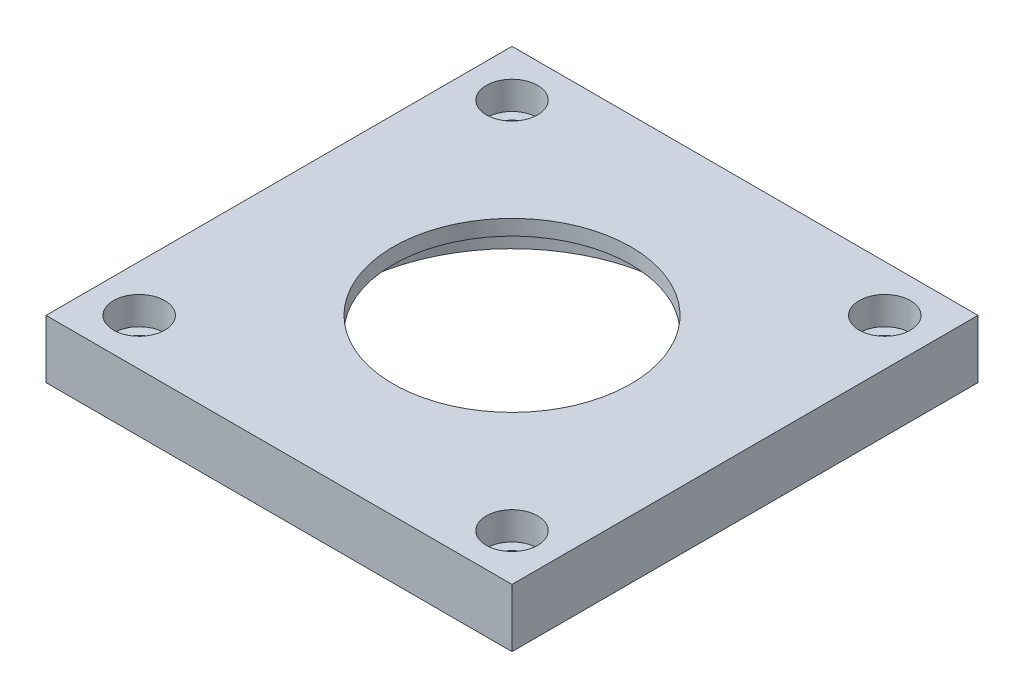
ISO-10303-21;
HEADER;
FILE_DESCRIPTION(('STEP AP214'),'2;1');
FILE_NAME('part.step','',(''),(''),'','','');
FILE_SCHEMA(('AUTOMOTIVE_DESIGN { 1 0 10303 214 1 1 1 1 }'));
ENDSEC;
DATA;
#1=APPLICATION_CONTEXT('core data for automotive mechanical design processes');
#2=APPLICATION_PROTOCOL_DEFINITION('international standard','automotive_design',2000,#1);
#3=PRODUCT_CONTEXT('',#1,'mechanical');
#4=PRODUCT('Part','Part','',(#3));
#5=PRODUCT_RELATED_PRODUCT_CATEGORY('part','',(#4));
#6=PRODUCT_DEFINITION_FORMATION('','',#4);
#7=PRODUCT_DEFINITION_CONTEXT('part definition',#1,'design');
#8=PRODUCT_DEFINITION('design','',#6,#7);
#9=PRODUCT_DEFINITION_SHAPE('','',#8);
#10=(LENGTH_UNIT() NAMED_UNIT(*) SI_UNIT(.MILLI.,.METRE.));
#11=(NAMED_UNIT(*) PLANE_ANGLE_UNIT() SI_UNIT($,.RADIAN.));
#12=(NAMED_UNIT(*) SI_UNIT($,.STERADIAN.) SOLID_ANGLE_UNIT());
#13=UNCERTAINTY_MEASURE_WITH_UNIT(LENGTH_MEASURE(1.E-05),#10,'distance_accuracy_value','');
#14=(GEOMETRIC_REPRESENTATION_CONTEXT(3) GLOBAL_UNCERTAINTY_ASSIGNED_CONTEXT((#13)) GLOBAL_UNIT_ASSIGNED_CONTEXT((#10,
#11,#12)) REPRESENTATION_CONTEXT('',''));
#15=CARTESIAN_POINT('',(0.,0.,0.));
#16=DIRECTION('',(0.,0.,1.));
#17=DIRECTION('',(1.,0.,0.));
#18=AXIS2_PLACEMENT_3D('',#15,#16,#17);
#19=CARTESIAN_POINT('',(-40.,12.5,40.));
#20=DIRECTION('',(0.,-1.,0.));
#21=DIRECTION('',(0.,0.,-1.));
#22=AXIS2_PLACEMENT_3D('',#19,#20,#21);
#23=CYLINDRICAL_SURFACE('',#22,3.25);
#24=CARTESIAN_POINT('',(-40.,0.,40.));
#25=DIRECTION('',(0.,-1.,0.));
#26=DIRECTION('',(0.,0.,-1.));
#27=AXIS2_PLACEMENT_3D('',#24,#25,#26);
#28=CIRCLE('',#27,3.25);
#29=CARTESIAN_POINT('',(-40.,0.,36.75));
#30=VERTEX_POINT('',#29);
#31=EDGE_CURVE('E164',#30,#30,#28,.T.);
#32=ORIENTED_EDGE('',*,*,#31,.T.);
#33=EDGE_LOOP('',(#32));
#34=FACE_BOUND('',#33,.T.);
#35=CARTESIAN_POINT('',(-40.,6.5,40.));
#36=DIRECTION('',(0.,1.,0.));
#37=DIRECTION('',(0.,0.,1.));
#38=AXIS2_PLACEMENT_3D('',#35,#36,#37);
#39=CIRCLE('',#38,3.25);
#40=CARTESIAN_POINT('',(-40.,6.5,43.25));
#41=VERTEX_POINT('',#40);
#42=EDGE_CURVE('E47',#41,#41,#39,.F.);
#43=ORIENTED_EDGE('',*,*,#42,.F.);
#44=EDGE_LOOP('',(#43));
#45=FACE_BOUND('',#44,.T.);
#46=ADVANCED_FACE('F43',(#34,#45),#23,.F.);
#47=CARTESIAN_POINT('',(39.9999999999996,12.5,40.0000000000004));
#48=DIRECTION('',(0.,-1.,0.));
#49=DIRECTION('',(0.,0.,-1.));
#50=AXIS2_PLACEMENT_3D('',#47,#48,#49);
#51=CYLINDRICAL_SURFACE('',#50,3.25);
#52=CARTESIAN_POINT('',(39.9999999999996,0.,40.0000000000004));
#53=DIRECTION('',(0.,-1.,0.));
#54=DIRECTION('',(-1.,0.,0.));
#55=AXIS2_PLACEMENT_3D('',#52,#53,#54);
#56=CIRCLE('',#55,3.25);
#57=CARTESIAN_POINT('',(36.7499999999996,0.,40.0000000000004));
#58=VERTEX_POINT('',#57);
#59=EDGE_CURVE('E134',#58,#58,#56,.T.);
#60=ORIENTED_EDGE('',*,*,#59,.T.);
#61=EDGE_LOOP('',(#60));
#62=FACE_BOUND('',#61,.T.);
#63=CARTESIAN_POINT('',(39.9999999999996,6.5,40.0000000000004));
#64=DIRECTION('',(0.,1.,0.));
#65=DIRECTION('',(0.,0.,1.));
#66=AXIS2_PLACEMENT_3D('',#63,#64,#65);
#67=CIRCLE('',#66,3.25);
#68=CARTESIAN_POINT('',(39.9999999999996,6.5,43.2500000000004));
#69=VERTEX_POINT('',#68);
#70=EDGE_CURVE('E139',#69,#69,#67,.F.);
#71=ORIENTED_EDGE('',*,*,#70,.F.);
#72=EDGE_LOOP('',(#71));
#73=FACE_BOUND('',#72,.T.);
#74=ADVANCED_FACE('F212',(#62,#73),#51,.F.);
#75=CARTESIAN_POINT('',(40.,12.5,-40.));
#76=DIRECTION('',(0.,-1.,0.));
#77=DIRECTION('',(0.,0.,-1.));
#78=AXIS2_PLACEMENT_3D('',#75,#76,#77);
#79=CYLINDRICAL_SURFACE('',#78,3.25);
#80=CARTESIAN_POINT('',(40.,0.,-40.));
#81=DIRECTION('',(0.,-1.,0.));
#82=DIRECTION('',(0.,0.,1.));
#83=AXIS2_PLACEMENT_3D('',#80,#81,#82);
#84=CIRCLE('',#83,3.25);
#85=CARTESIAN_POINT('',(40.,0.,-36.75));
#86=VERTEX_POINT('',#85);
#87=EDGE_CURVE('E165',#86,#86,#84,.T.);
#88=ORIENTED_EDGE('',*,*,#87,.T.);
#89=EDGE_LOOP('',(#88));
#90=FACE_BOUND('',#89,.T.);
#91=CARTESIAN_POINT('',(40.,6.5,-40.));
#92=DIRECTION('',(0.,1.,0.));
#93=DIRECTION('',(0.,0.,1.));
#94=AXIS2_PLACEMENT_3D('',#91,#92,#93);
#95=CIRCLE('',#94,3.25);
#96=CARTESIAN_POINT('',(40.,6.5,-36.75));
#97=VERTEX_POINT('',#96);
#98=EDGE_CURVE('E136',#97,#97,#95,.F.);
#99=ORIENTED_EDGE('',*,*,#98,.F.);
#100=EDGE_LOOP('',(#99));
#101=FACE_BOUND('',#100,.T.);
#102=ADVANCED_FACE('F218',(#90,#101),#79,.F.);
#103=CARTESIAN_POINT('',(-39.9999999999999,12.5,-40.0000000000001));
#104=DIRECTION('',(0.,-1.,0.));
#105=DIRECTION('',(0.,0.,-1.));
#106=AXIS2_PLACEMENT_3D('',#103,#104,#105);
#107=CYLINDRICAL_SURFACE('',#106,3.25);
#108=CARTESIAN_POINT('',(-39.9999999999999,0.,-40.0000000000001));
#109=DIRECTION('',(0.,-1.,0.));
#110=DIRECTION('',(1.,0.,0.));
#111=AXIS2_PLACEMENT_3D('',#108,#109,#110);
#112=CIRCLE('',#111,3.25);
#113=CARTESIAN_POINT('',(-36.7499999999999,0.,-40.0000000000001));
#114=VERTEX_POINT('',#113);
#115=EDGE_CURVE('E160',#114,#114,#112,.T.);
#116=ORIENTED_EDGE('',*,*,#115,.T.);
#117=EDGE_LOOP('',(#116));
#118=FACE_BOUND('',#117,.T.);
#119=CARTESIAN_POINT('',(-39.9999999999999,6.5,-40.0000000000001));
#120=DIRECTION('',(0.,1.,0.));
#121=DIRECTION('',(0.,0.,1.));
#122=AXIS2_PLACEMENT_3D('',#119,#120,#121);
#123=CIRCLE('',#122,3.25);
#124=CARTESIAN_POINT('',(-39.9999999999999,6.5,-36.7500000000001));
#125=VERTEX_POINT('',#124);
#126=EDGE_CURVE('E130',#125,#125,#123,.F.);
#127=ORIENTED_EDGE('',*,*,#126,.F.);
#128=EDGE_LOOP('',(#127));
#129=FACE_BOUND('',#128,.T.);
#130=ADVANCED_FACE('F356',(#118,#129),#107,.F.);
#131=CARTESIAN_POINT('',(50.,12.5,-50.));
#132=DIRECTION('',(-1.,0.,0.));
#133=DIRECTION('',(0.,0.,1.));
#134=AXIS2_PLACEMENT_3D('',#131,#132,#133);
#135=PLANE('',#134);
#136=DIRECTION('',(0.,0.,-1.));
#137=VECTOR('',#136,1.);
#138=CARTESIAN_POINT('',(50.,0.,-50.));
#139=LINE('',#138,#137);
#140=CARTESIAN_POINT('',(50.,0.,50.));
#141=VERTEX_POINT('',#140);
#142=CARTESIAN_POINT('',(50.,0.,-50.));
#143=VERTEX_POINT('',#142);
#144=EDGE_CURVE('E115',#141,#143,#139,.T.);
#145=ORIENTED_EDGE('',*,*,#144,.T.);
#146=DIRECTION('',(0.,-1.,0.));
#147=VECTOR('',#146,1.);
#148=CARTESIAN_POINT('',(50.,12.5,-50.));
#149=LINE('',#148,#147);
#150=CARTESIAN_POINT('',(50.,12.5,-50.));
#151=VERTEX_POINT('',#150);
#152=EDGE_CURVE('E11',#151,#143,#149,.T.);
#153=ORIENTED_EDGE('',*,*,#152,.F.);
#154=DIRECTION('',(0.,0.,-1.));
#155=VECTOR('',#154,1.);
#156=CARTESIAN_POINT('',(50.,12.5,-50.));
#157=LINE('',#156,#155);
#158=CARTESIAN_POINT('',(50.,12.5,50.));
#159=VERTEX_POINT('',#158);
#160=EDGE_CURVE('E98',#159,#151,#157,.T.);
#161=ORIENTED_EDGE('',*,*,#160,.F.);
#162=DIRECTION('',(0.,-1.,0.));
#163=VECTOR('',#162,1.);
#164=CARTESIAN_POINT('',(50.,12.5,50.));
#165=LINE('',#164,#163);
#166=EDGE_CURVE('E111',#159,#141,#165,.T.);
#167=ORIENTED_EDGE('',*,*,#166,.T.);
#168=EDGE_LOOP('',(#145,#153,#161,#167));
#169=FACE_BOUND('',#168,.T.);
#170=ADVANCED_FACE('F45',(#169),#135,.F.);
#171=CARTESIAN_POINT('',(-50.,12.5,-50.));
#172=DIRECTION('',(0.,0.,1.));
#173=DIRECTION('',(1.,0.,0.));
#174=AXIS2_PLACEMENT_3D('',#171,#172,#173);
#175=PLANE('',#174);
#176=DIRECTION('',(-1.,0.,0.));
#177=VECTOR('',#176,1.);
#178=CARTESIAN_POINT('',(-50.,0.,-50.));
#179=LINE('',#178,#177);
#180=CARTESIAN_POINT('',(-50.,0.,-50.));
#181=VERTEX_POINT('',#180);
#182=EDGE_CURVE('E103',#143,#181,#179,.T.);
#183=ORIENTED_EDGE('',*,*,#182,.T.);
#184=DIRECTION('',(0.,-1.,0.));
#185=VECTOR('',#184,1.);
#186=CARTESIAN_POINT('',(-50.,12.5,-50.));
#187=LINE('',#186,#185);
#188=CARTESIAN_POINT('',(-50.,12.5,-50.));
#189=VERTEX_POINT('',#188);
#190=EDGE_CURVE('E54',#189,#181,#187,.T.);
#191=ORIENTED_EDGE('',*,*,#190,.F.);
#192=DIRECTION('',(-1.,0.,0.));
#193=VECTOR('',#192,1.);
#194=CARTESIAN_POINT('',(-50.,12.5,-50.));
#195=LINE('',#194,#193);
#196=EDGE_CURVE('E93',#151,#189,#195,.T.);
#197=ORIENTED_EDGE('',*,*,#196,.F.);
#198=ORIENTED_EDGE('',*,*,#152,.T.);
#199=EDGE_LOOP('',(#183,#191,#197,#198));
#200=FACE_BOUND('',#199,.T.);
#201=ADVANCED_FACE('F102',(#200),#175,.F.);
#202=CARTESIAN_POINT('',(-50.,12.5,-50.));
#203=DIRECTION('',(1.,0.,0.));
#204=DIRECTION('',(0.,0.,-1.));
#205=AXIS2_PLACEMENT_3D('',#202,#203,#204);
#206=PLANE('',#205);
#207=DIRECTION('',(0.,0.,1.));
#208=VECTOR('',#207,1.);
#209=CARTESIAN_POINT('',(-50.,0.,-50.));
#210=LINE('',#209,#208);
#211=CARTESIAN_POINT('',(-50.,0.,50.));
#212=VERTEX_POINT('',#211);
#213=EDGE_CURVE('E80',#181,#212,#210,.T.);
#214=ORIENTED_EDGE('',*,*,#213,.T.);
#215=DIRECTION('',(0.,-1.,0.));
#216=VECTOR('',#215,1.);
#217=CARTESIAN_POINT('',(-50.,12.5,50.));
#218=LINE('',#217,#216);
#219=CARTESIAN_POINT('',(-50.,12.5,50.));
#220=VERTEX_POINT('',#219);
#221=EDGE_CURVE('E105',#220,#212,#218,.T.);
#222=ORIENTED_EDGE('',*,*,#221,.F.);
#223=DIRECTION('',(0.,0.,1.));
#224=VECTOR('',#223,1.);
#225=CARTESIAN_POINT('',(-50.,12.5,-50.));
#226=LINE('',#225,#224);
#227=EDGE_CURVE('E96',#189,#220,#226,.T.);
#228=ORIENTED_EDGE('',*,*,#227,.F.);
#229=ORIENTED_EDGE('',*,*,#190,.T.);
#230=EDGE_LOOP('',(#214,#222,#228,#229));
#231=FACE_BOUND('',#230,.T.);
#232=ADVANCED_FACE('F107',(#231),#206,.F.);
#233=CARTESIAN_POINT('',(-50.,12.5,50.));
#234=DIRECTION('',(0.,0.,-1.));
#235=DIRECTION('',(-1.,0.,0.));
#236=AXIS2_PLACEMENT_3D('',#233,#234,#235);
#237=PLANE('',#236);
#238=DIRECTION('',(1.,0.,0.));
#239=VECTOR('',#238,1.);
#240=CARTESIAN_POINT('',(-50.,0.,50.));
#241=LINE('',#240,#239);
#242=EDGE_CURVE('E86',#212,#141,#241,.T.);
#243=ORIENTED_EDGE('',*,*,#242,.T.);
#244=ORIENTED_EDGE('',*,*,#166,.F.);
#245=DIRECTION('',(1.,0.,0.));
#246=VECTOR('',#245,1.);
#247=CARTESIAN_POINT('',(-50.,12.5,50.));
#248=LINE('',#247,#246);
#249=EDGE_CURVE('E63',#220,#159,#248,.T.);
#250=ORIENTED_EDGE('',*,*,#249,.F.);
#251=ORIENTED_EDGE('',*,*,#221,.T.);
#252=EDGE_LOOP('',(#243,#244,#250,#251));
#253=FACE_BOUND('',#252,.T.);
#254=ADVANCED_FACE('F201',(#253),#237,.F.);
#255=CARTESIAN_POINT('',(0.,12.5,0.));
#256=DIRECTION('',(0.,1.,0.));
#257=DIRECTION('',(0.,0.,1.));
#258=AXIS2_PLACEMENT_3D('',#255,#256,#257);
#259=PLANE('',#258);
#260=CARTESIAN_POINT('',(40.0000000000003,12.5,-39.9999999999997));
#261=DIRECTION('',(0.,1.,0.));
#262=DIRECTION('',(-1.,0.,0.));
#263=AXIS2_PLACEMENT_3D('',#260,#261,#262);
#264=CIRCLE('',#263,5.5);
#265=CARTESIAN_POINT('',(34.5000000000003,12.5,-39.9999999999997));
#266=VERTEX_POINT('',#265);
#267=EDGE_CURVE('E474',#266,#266,#264,.T.);
#268=ORIENTED_EDGE('',*,*,#267,.F.);
#269=EDGE_LOOP('',(#268));
#270=FACE_BOUND('',#269,.T.);
#271=CARTESIAN_POINT('',(39.9999999999999,12.5,40.0000000000001));
#272=DIRECTION('',(0.,1.,0.));
#273=DIRECTION('',(0.,0.,-1.));
#274=AXIS2_PLACEMENT_3D('',#271,#272,#273);
#275=CIRCLE('',#274,5.5);
#276=CARTESIAN_POINT('',(39.9999999999999,12.5,34.5000000000001));
#277=VERTEX_POINT('',#276);
#278=EDGE_CURVE('E464',#277,#277,#275,.T.);
#279=ORIENTED_EDGE('',*,*,#278,.F.);
#280=EDGE_LOOP('',(#279));
#281=FACE_BOUND('',#280,.T.);
#282=CARTESIAN_POINT('',(-40.0000000000006,12.5,39.9999999999994));
#283=DIRECTION('',(0.,1.,0.));
#284=DIRECTION('',(1.,0.,0.));
#285=AXIS2_PLACEMENT_3D('',#282,#283,#284);
#286=CIRCLE('',#285,5.5);
#287=CARTESIAN_POINT('',(-34.5000000000006,12.5,39.9999999999995));
#288=VERTEX_POINT('',#287);
#289=EDGE_CURVE('E460',#288,#288,#286,.T.);
#290=ORIENTED_EDGE('',*,*,#289,.F.);
#291=EDGE_LOOP('',(#290));
#292=FACE_BOUND('',#291,.T.);
#293=CARTESIAN_POINT('',(-39.9999999999999,12.5,-40.0000000000001));
#294=DIRECTION('',(0.,1.,0.));
#295=DIRECTION('',(0.,0.,1.));
#296=AXIS2_PLACEMENT_3D('',#293,#294,#295);
#297=CIRCLE('',#296,5.5);
#298=CARTESIAN_POINT('',(-39.9999999999999,12.5,-34.5000000000001));
#299=VERTEX_POINT('',#298);
#300=EDGE_CURVE('E147',#299,#299,#297,.T.);
#301=ORIENTED_EDGE('',*,*,#300,.F.);
#302=EDGE_LOOP('',(#301));
#303=FACE_BOUND('',#302,.T.);
#304=CARTESIAN_POINT('',(0.,12.5,0.));
#305=DIRECTION('',(0.,-1.,0.));
#306=DIRECTION('',(0.,0.,-1.));
#307=AXIS2_PLACEMENT_3D('',#304,#305,#306);
#308=CIRCLE('',#307,25.5);
#309=CARTESIAN_POINT('',(0.,12.5,-25.5));
#310=VERTEX_POINT('',#309);
#311=EDGE_CURVE('E176',#310,#310,#308,.T.);
#312=ORIENTED_EDGE('',*,*,#311,.T.);
#313=EDGE_LOOP('',(#312));
#314=FACE_BOUND('',#313,.T.);
#315=ORIENTED_EDGE('',*,*,#160,.T.);
#316=ORIENTED_EDGE('',*,*,#196,.T.);
#317=ORIENTED_EDGE('',*,*,#227,.T.);
#318=ORIENTED_EDGE('',*,*,#249,.T.);
#319=EDGE_LOOP('',(#315,#316,#317,#318));
#320=FACE_BOUND('',#319,.T.);
#321=ADVANCED_FACE('F94',(#270,#281,#292,#303,#314,#320),#259,.T.);
#322=CARTESIAN_POINT('',(0.,0.,0.));
#323=DIRECTION('',(0.,1.,0.));
#324=DIRECTION('',(0.,0.,1.));
#325=AXIS2_PLACEMENT_3D('',#322,#323,#324);
#326=PLANE('',#325);
#327=ORIENTED_EDGE('',*,*,#115,.F.);
#328=EDGE_LOOP('',(#327));
#329=FACE_BOUND('',#328,.T.);
#330=ORIENTED_EDGE('',*,*,#87,.F.);
#331=EDGE_LOOP('',(#330));
#332=FACE_BOUND('',#331,.T.);
#333=ORIENTED_EDGE('',*,*,#59,.F.);
#334=EDGE_LOOP('',(#333));
#335=FACE_BOUND('',#334,.T.);
#336=ORIENTED_EDGE('',*,*,#31,.F.);
#337=EDGE_LOOP('',(#336));
#338=FACE_BOUND('',#337,.T.);
#339=CARTESIAN_POINT('',(0.,0.,0.));
#340=DIRECTION('',(0.,-1.,0.));
#341=DIRECTION('',(0.,0.,-1.));
#342=AXIS2_PLACEMENT_3D('',#339,#340,#341);
#343=CIRCLE('',#342,35.2);
#344=CARTESIAN_POINT('',(0.,0.,-35.2));
#345=VERTEX_POINT('',#344);
#346=EDGE_CURVE('E180',#345,#345,#343,.T.);
#347=ORIENTED_EDGE('',*,*,#346,.F.);
#348=EDGE_LOOP('',(#347));
#349=FACE_BOUND('',#348,.T.);
#350=ORIENTED_EDGE('',*,*,#144,.F.);
#351=ORIENTED_EDGE('',*,*,#242,.F.);
#352=ORIENTED_EDGE('',*,*,#213,.F.);
#353=ORIENTED_EDGE('',*,*,#182,.F.);
#354=EDGE_LOOP('',(#350,#351,#352,#353));
#355=FACE_BOUND('',#354,.T.);
#356=ADVANCED_FACE('F194',(#329,#332,#335,#338,#349,#355),#326,.F.);
#357=CARTESIAN_POINT('',(0.,9.2,0.));
#358=DIRECTION('',(0.,-1.,0.));
#359=DIRECTION('',(0.,0.,-1.));
#360=AXIS2_PLACEMENT_3D('',#357,#358,#359);
#361=CYLINDRICAL_SURFACE('',#360,35.2);
#362=CARTESIAN_POINT('',(0.,9.2,0.));
#363=DIRECTION('',(0.,-1.,0.));
#364=DIRECTION('',(0.,0.,-1.));
#365=AXIS2_PLACEMENT_3D('',#362,#363,#364);
#366=CIRCLE('',#365,35.2);
#367=CARTESIAN_POINT('',(0.,9.2,-35.2));
#368=VERTEX_POINT('',#367);
#369=EDGE_CURVE('E119',#368,#368,#366,.T.);
#370=ORIENTED_EDGE('',*,*,#369,.F.);
#371=EDGE_LOOP('',(#370));
#372=FACE_BOUND('',#371,.T.);
#373=ORIENTED_EDGE('',*,*,#346,.T.);
#374=EDGE_LOOP('',(#373));
#375=FACE_BOUND('',#374,.T.);
#376=ADVANCED_FACE('F192',(#372,#375),#361,.F.);
#377=CARTESIAN_POINT('',(0.,9.2,0.));
#378=DIRECTION('',(0.,-1.,0.));
#379=DIRECTION('',(0.,0.,-1.));
#380=AXIS2_PLACEMENT_3D('',#377,#378,#379);
#381=PLANE('',#380);
#382=CARTESIAN_POINT('',(0.,9.2,0.));
#383=DIRECTION('',(0.,-1.,0.));
#384=DIRECTION('',(0.,0.,-1.));
#385=AXIS2_PLACEMENT_3D('',#382,#383,#384);
#386=CIRCLE('',#385,25.5);
#387=CARTESIAN_POINT('',(0.,9.2,-25.5));
#388=VERTEX_POINT('',#387);
#389=EDGE_CURVE('E175',#388,#388,#386,.T.);
#390=ORIENTED_EDGE('',*,*,#389,.F.);
#391=EDGE_LOOP('',(#390));
#392=FACE_BOUND('',#391,.T.);
#393=ORIENTED_EDGE('',*,*,#369,.T.);
#394=EDGE_LOOP('',(#393));
#395=FACE_BOUND('',#394,.T.);
#396=ADVANCED_FACE('F228',(#392,#395),#381,.T.);
#397=CARTESIAN_POINT('',(0.,12.5,0.));
#398=DIRECTION('',(0.,-1.,0.));
#399=DIRECTION('',(0.,0.,-1.));
#400=AXIS2_PLACEMENT_3D('',#397,#398,#399);
#401=CYLINDRICAL_SURFACE('',#400,25.5);
#402=ORIENTED_EDGE('',*,*,#311,.F.);
#403=EDGE_LOOP('',(#402));
#404=FACE_BOUND('',#403,.T.);
#405=ORIENTED_EDGE('',*,*,#389,.T.);
#406=EDGE_LOOP('',(#405));
#407=FACE_BOUND('',#406,.T.);
#408=ADVANCED_FACE('F224',(#404,#407),#401,.F.);
#409=CARTESIAN_POINT('',(-39.9999999999999,6.5,-40.0000000000001));
#410=DIRECTION('',(0.,1.,0.));
#411=DIRECTION('',(0.,0.,1.));
#412=AXIS2_PLACEMENT_3D('',#409,#410,#411);
#413=PLANE('',#412);
#414=CARTESIAN_POINT('',(-39.9999999999999,6.5,-40.0000000000001));
#415=DIRECTION('',(0.,1.,0.));
#416=DIRECTION('',(0.,0.,1.));
#417=AXIS2_PLACEMENT_3D('',#414,#415,#416);
#418=CIRCLE('',#417,5.5);
#419=CARTESIAN_POINT('',(-39.9999999999999,6.5,-34.5000000000001));
#420=VERTEX_POINT('',#419);
#421=EDGE_CURVE('E135',#420,#420,#418,.T.);
#422=ORIENTED_EDGE('',*,*,#421,.T.);
#423=EDGE_LOOP('',(#422));
#424=FACE_BOUND('',#423,.T.);
#425=ORIENTED_EDGE('',*,*,#126,.T.);
#426=EDGE_LOOP('',(#425));
#427=FACE_BOUND('',#426,.T.);
#428=ADVANCED_FACE('F227',(#424,#427),#413,.T.);
#429=CARTESIAN_POINT('',(-39.9999999999999,6.5,-40.0000000000001));
#430=DIRECTION('',(0.,1.,0.));
#431=DIRECTION('',(0.,0.,1.));
#432=AXIS2_PLACEMENT_3D('',#429,#430,#431);
#433=CYLINDRICAL_SURFACE('',#432,5.5);
#434=ORIENTED_EDGE('',*,*,#421,.F.);
#435=EDGE_LOOP('',(#434));
#436=FACE_BOUND('',#435,.T.);
#437=ORIENTED_EDGE('',*,*,#300,.T.);
#438=EDGE_LOOP('',(#437));
#439=FACE_BOUND('',#438,.T.);
#440=ADVANCED_FACE('F255',(#436,#439),#433,.F.);
#441=CARTESIAN_POINT('',(40.0000000000003,6.5,-39.9999999999997));
#442=DIRECTION('',(0.,1.,0.));
#443=DIRECTION('',(-1.,0.,0.));
#444=AXIS2_PLACEMENT_3D('',#441,#442,#443);
#445=PLANE('',#444);
#446=CARTESIAN_POINT('',(40.0000000000003,6.5,-39.9999999999997));
#447=DIRECTION('',(0.,1.,0.));
#448=DIRECTION('',(-1.,0.,0.));
#449=AXIS2_PLACEMENT_3D('',#446,#447,#448);
#450=CIRCLE('',#449,5.5);
#451=CARTESIAN_POINT('',(34.5000000000003,6.5,-39.9999999999997));
#452=VERTEX_POINT('',#451);
#453=EDGE_CURVE('E140',#452,#452,#450,.T.);
#454=ORIENTED_EDGE('',*,*,#453,.T.);
#455=EDGE_LOOP('',(#454));
#456=FACE_BOUND('',#455,.T.);
#457=ORIENTED_EDGE('',*,*,#98,.T.);
#458=EDGE_LOOP('',(#457));
#459=FACE_BOUND('',#458,.T.);
#460=ADVANCED_FACE('F264',(#456,#459),#445,.T.);
#461=CARTESIAN_POINT('',(40.0000000000003,6.5,-39.9999999999997));
#462=DIRECTION('',(0.,1.,0.));
#463=DIRECTION('',(0.,0.,1.));
#464=AXIS2_PLACEMENT_3D('',#461,#462,#463);
#465=CYLINDRICAL_SURFACE('',#464,5.5);
#466=ORIENTED_EDGE('',*,*,#453,.F.);
#467=EDGE_LOOP('',(#466));
#468=FACE_BOUND('',#467,.T.);
#469=ORIENTED_EDGE('',*,*,#267,.T.);
#470=EDGE_LOOP('',(#469));
#471=FACE_BOUND('',#470,.T.);
#472=ADVANCED_FACE('F272',(#468,#471),#465,.F.);
#473=CARTESIAN_POINT('',(39.9999999999999,6.5,40.0000000000001));
#474=DIRECTION('',(0.,1.,0.));
#475=DIRECTION('',(0.,0.,-1.));
#476=AXIS2_PLACEMENT_3D('',#473,#474,#475);
#477=PLANE('',#476);
#478=CARTESIAN_POINT('',(39.9999999999999,6.5,40.0000000000001));
#479=DIRECTION('',(0.,1.,0.));
#480=DIRECTION('',(0.,0.,-1.));
#481=AXIS2_PLACEMENT_3D('',#478,#479,#480);
#482=CIRCLE('',#481,5.5);
#483=CARTESIAN_POINT('',(39.9999999999999,6.5,34.5000000000001));
#484=VERTEX_POINT('',#483);
#485=EDGE_CURVE('E470',#484,#484,#482,.T.);
#486=ORIENTED_EDGE('',*,*,#485,.T.);
#487=EDGE_LOOP('',(#486));
#488=FACE_BOUND('',#487,.T.);
#489=ORIENTED_EDGE('',*,*,#70,.T.);
#490=EDGE_LOOP('',(#489));
#491=FACE_BOUND('',#490,.T.);
#492=ADVANCED_FACE('F281',(#488,#491),#477,.T.);
#493=CARTESIAN_POINT('',(39.9999999999999,6.5,40.0000000000001));
#494=DIRECTION('',(0.,1.,0.));
#495=DIRECTION('',(0.,0.,1.));
#496=AXIS2_PLACEMENT_3D('',#493,#494,#495);
#497=CYLINDRICAL_SURFACE('',#496,5.5);
#498=ORIENTED_EDGE('',*,*,#485,.F.);
#499=EDGE_LOOP('',(#498));
#500=FACE_BOUND('',#499,.T.);
#501=ORIENTED_EDGE('',*,*,#278,.T.);
#502=EDGE_LOOP('',(#501));
#503=FACE_BOUND('',#502,.T.);
#504=ADVANCED_FACE('F289',(#500,#503),#497,.F.);
#505=CARTESIAN_POINT('',(-40.0000000000006,6.5,39.9999999999994));
#506=DIRECTION('',(0.,1.,0.));
#507=DIRECTION('',(1.,0.,0.));
#508=AXIS2_PLACEMENT_3D('',#505,#506,#507);
#509=PLANE('',#508);
#510=CARTESIAN_POINT('',(-40.0000000000006,6.5,39.9999999999994));
#511=DIRECTION('',(0.,1.,0.));
#512=DIRECTION('',(1.,0.,0.));
#513=AXIS2_PLACEMENT_3D('',#510,#511,#512);
#514=CIRCLE('',#513,5.5);
#515=CARTESIAN_POINT('',(-34.5000000000006,6.5,39.9999999999995));
#516=VERTEX_POINT('',#515);
#517=EDGE_CURVE('E457',#516,#516,#514,.T.);
#518=ORIENTED_EDGE('',*,*,#517,.T.);
#519=EDGE_LOOP('',(#518));
#520=FACE_BOUND('',#519,.T.);
#521=ORIENTED_EDGE('',*,*,#42,.T.);
#522=EDGE_LOOP('',(#521));
#523=FACE_BOUND('',#522,.T.);
#524=ADVANCED_FACE('F297',(#520,#523),#509,.T.);
#525=CARTESIAN_POINT('',(-40.0000000000006,6.5,39.9999999999994));
#526=DIRECTION('',(0.,1.,0.));
#527=DIRECTION('',(0.,0.,1.));
#528=AXIS2_PLACEMENT_3D('',#525,#526,#527);
#529=CYLINDRICAL_SURFACE('',#528,5.5);
#530=ORIENTED_EDGE('',*,*,#517,.F.);
#531=EDGE_LOOP('',(#530));
#532=FACE_BOUND('',#531,.T.);
#533=ORIENTED_EDGE('',*,*,#289,.T.);
#534=EDGE_LOOP('',(#533));
#535=FACE_BOUND('',#534,.T.);
#536=ADVANCED_FACE('F305',(#532,#535),#529,.F.);
#537=CLOSED_SHELL('',(#46,#74,#102,#130,#170,#201,#232,#254,#321,#356,#376,#396,#408,#428,#440,
#460,#472,#492,#504,#524,#536));
#538=MANIFOLD_SOLID_BREP('B2',#537);
#539=ADVANCED_BREP_SHAPE_REPRESENTATION('',(#18,#538),#14);
#540=SHAPE_DEFINITION_REPRESENTATION(#9,#539);
ENDSEC;
END-ISO-10303-21;
